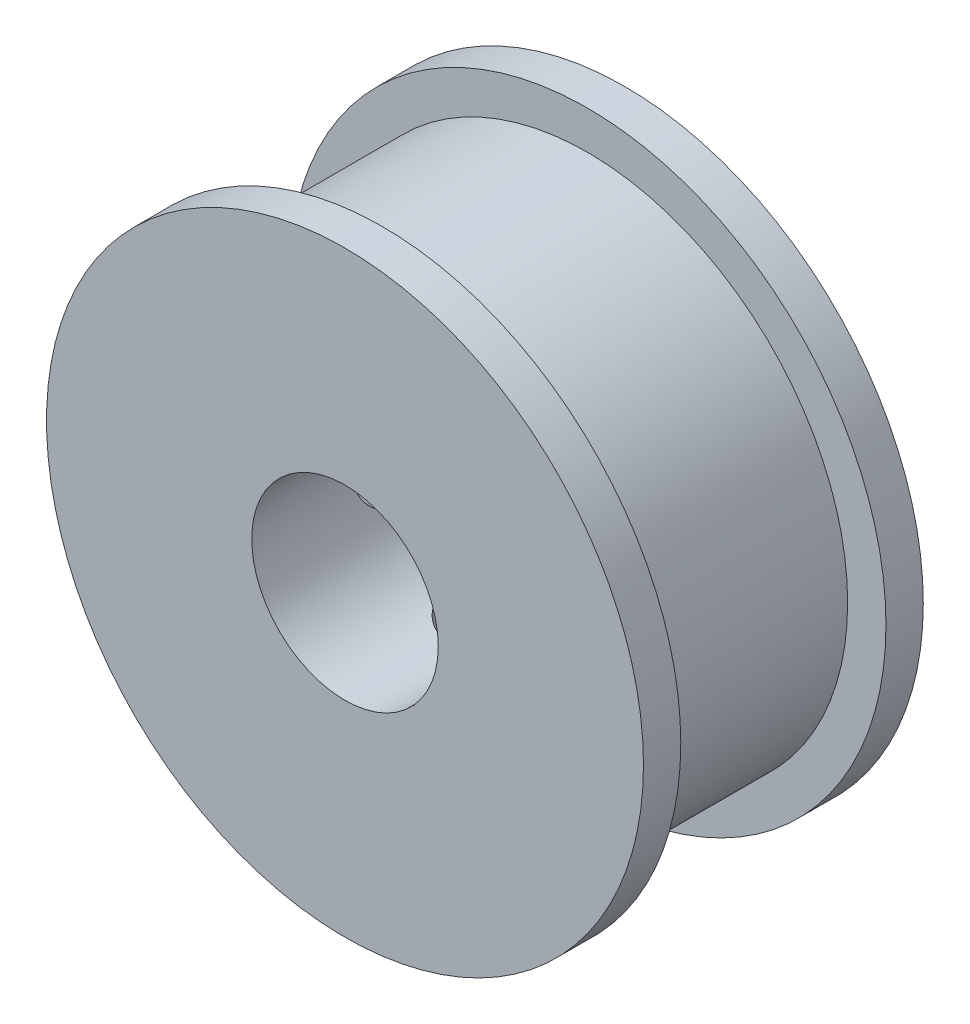
ISO-10303-21;
HEADER;
FILE_DESCRIPTION(('STEP AP214'),'2;1');
FILE_NAME('part.step','',(''),(''),'','','');
FILE_SCHEMA(('AUTOMOTIVE_DESIGN { 1 0 10303 214 1 1 1 1 }'));
ENDSEC;
DATA;
#1=APPLICATION_CONTEXT('core data for automotive mechanical design processes');
#2=APPLICATION_PROTOCOL_DEFINITION('international standard','automotive_design',2000,#1);
#3=PRODUCT_CONTEXT('',#1,'mechanical');
#4=PRODUCT('Part','Part','',(#3));
#5=PRODUCT_RELATED_PRODUCT_CATEGORY('part','',(#4));
#6=PRODUCT_DEFINITION_FORMATION('','',#4);
#7=PRODUCT_DEFINITION_CONTEXT('part definition',#1,'design');
#8=PRODUCT_DEFINITION('design','',#6,#7);
#9=PRODUCT_DEFINITION_SHAPE('','',#8);
#10=(LENGTH_UNIT() NAMED_UNIT(*) SI_UNIT(.MILLI.,.METRE.));
#11=(NAMED_UNIT(*) PLANE_ANGLE_UNIT() SI_UNIT($,.RADIAN.));
#12=(NAMED_UNIT(*) SI_UNIT($,.STERADIAN.) SOLID_ANGLE_UNIT());
#13=UNCERTAINTY_MEASURE_WITH_UNIT(LENGTH_MEASURE(1.E-05),#10,'distance_accuracy_value','');
#14=(GEOMETRIC_REPRESENTATION_CONTEXT(3) GLOBAL_UNCERTAINTY_ASSIGNED_CONTEXT((#13)) GLOBAL_UNIT_ASSIGNED_CONTEXT((#10,
#11,#12)) REPRESENTATION_CONTEXT('',''));
#15=CARTESIAN_POINT('',(0.,0.,0.));
#16=DIRECTION('',(0.,0.,1.));
#17=DIRECTION('',(1.,0.,0.));
#18=AXIS2_PLACEMENT_3D('',#15,#16,#17);
#19=CARTESIAN_POINT('',(0.,0.,2.));
#20=DIRECTION('',(0.,0.,-1.));
#21=DIRECTION('',(-1.,0.,0.));
#22=AXIS2_PLACEMENT_3D('',#19,#20,#21);
#23=CYLINDRICAL_SURFACE('',#22,16.);
#24=CARTESIAN_POINT('',(0.,0.,2.));
#25=DIRECTION('',(0.,0.,1.));
#26=DIRECTION('',(1.,0.,0.));
#27=AXIS2_PLACEMENT_3D('',#24,#25,#26);
#28=CIRCLE('',#27,16.);
#29=CARTESIAN_POINT('',(16.,0.,2.));
#30=VERTEX_POINT('',#29);
#31=EDGE_CURVE('E50',#30,#30,#28,.T.);
#32=ORIENTED_EDGE('',*,*,#31,.F.);
#33=EDGE_LOOP('',(#32));
#34=FACE_BOUND('',#33,.T.);
#35=CARTESIAN_POINT('',(0.,0.,0.));
#36=DIRECTION('',(0.,0.,1.));
#37=DIRECTION('',(1.,0.,0.));
#38=AXIS2_PLACEMENT_3D('',#35,#36,#37);
#39=CIRCLE('',#38,16.);
#40=CARTESIAN_POINT('',(16.,0.,0.));
#41=VERTEX_POINT('',#40);
#42=EDGE_CURVE('E56',#41,#41,#39,.T.);
#43=ORIENTED_EDGE('',*,*,#42,.T.);
#44=EDGE_LOOP('',(#43));
#45=FACE_BOUND('',#44,.T.);
#46=ADVANCED_FACE('F37',(#34,#45),#23,.T.);
#47=CARTESIAN_POINT('',(0.,0.,2.));
#48=DIRECTION('',(0.,0.,1.));
#49=DIRECTION('',(1.,0.,0.));
#50=AXIS2_PLACEMENT_3D('',#47,#48,#49);
#51=PLANE('',#50);
#52=CARTESIAN_POINT('',(0.,0.,2.));
#53=DIRECTION('',(0.,0.,1.));
#54=DIRECTION('',(1.,0.,0.));
#55=AXIS2_PLACEMENT_3D('',#52,#53,#54);
#56=CIRCLE('',#55,13.945);
#57=CARTESIAN_POINT('',(13.945,0.,2.));
#58=VERTEX_POINT('',#57);
#59=EDGE_CURVE('E10',#58,#58,#56,.T.);
#60=ORIENTED_EDGE('',*,*,#59,.F.);
#61=EDGE_LOOP('',(#60));
#62=FACE_BOUND('',#61,.T.);
#63=ORIENTED_EDGE('',*,*,#31,.T.);
#64=EDGE_LOOP('',(#63));
#65=FACE_BOUND('',#64,.T.);
#66=ADVANCED_FACE('F107',(#62,#65),#51,.T.);
#67=CARTESIAN_POINT('',(0.,0.,0.));
#68=DIRECTION('',(0.,0.,1.));
#69=DIRECTION('',(1.,0.,0.));
#70=AXIS2_PLACEMENT_3D('',#67,#68,#69);
#71=PLANE('',#70);
#72=CARTESIAN_POINT('',(0.,0.,0.));
#73=DIRECTION('',(0.,0.,1.));
#74=DIRECTION('',(1.,0.,0.));
#75=AXIS2_PLACEMENT_3D('',#72,#73,#74);
#76=CIRCLE('',#75,5.);
#77=CARTESIAN_POINT('',(5.,0.,0.));
#78=VERTEX_POINT('',#77);
#79=EDGE_CURVE('E96',#78,#78,#76,.T.);
#80=ORIENTED_EDGE('',*,*,#79,.T.);
#81=EDGE_LOOP('',(#80));
#82=FACE_BOUND('',#81,.T.);
#83=ORIENTED_EDGE('',*,*,#42,.F.);
#84=EDGE_LOOP('',(#83));
#85=FACE_BOUND('',#84,.T.);
#86=ADVANCED_FACE('F104',(#82,#85),#71,.F.);
#87=CARTESIAN_POINT('',(0.,0.,13.));
#88=DIRECTION('',(0.,0.,-1.));
#89=DIRECTION('',(-1.,0.,0.));
#90=AXIS2_PLACEMENT_3D('',#87,#88,#89);
#91=CYLINDRICAL_SURFACE('',#90,13.945);
#92=CARTESIAN_POINT('',(-13.945,0.,9.5));
#93=CARTESIAN_POINT('',(-13.9449982655467,-0.111725944881087,9.49999535043122));
#94=CARTESIAN_POINT('',(-13.9436431920022,-0.223518121905761,9.49060638937284));
#95=CARTESIAN_POINT('',(-13.9383679288523,-0.443981632184145,9.45330589604952));
#96=CARTESIAN_POINT('',(-13.9344451909274,-0.552649752951827,9.42537596210905));
#97=CARTESIAN_POINT('',(-13.9244757326362,-0.76364237886481,9.35184193419321));
#98=CARTESIAN_POINT('',(-13.9184305689848,-0.865971468897057,9.30625079148636));
#99=CARTESIAN_POINT('',(-13.9048854651112,-1.06151001299836,9.19871927063412));
#100=CARTESIAN_POINT('',(-13.897385740202,-1.15472081374425,9.13678131175586));
#101=CARTESIAN_POINT('',(-13.8817063382048,-1.3300616267768,8.99784094992483));
#102=CARTESIAN_POINT('',(-13.8735226128042,-1.41211682406785,8.92074457845407));
#103=CARTESIAN_POINT('',(-13.8574295164984,-1.5621720009626,8.75387800901321));
#104=CARTESIAN_POINT('',(-13.8495201608663,-1.63017119916254,8.66410710690485));
#105=CARTESIAN_POINT('',(-13.834831945192,-1.75047203324694,8.4739414372933));
#106=CARTESIAN_POINT('',(-13.8280583146169,-1.802701896444,8.37350082673225));
#107=CARTESIAN_POINT('',(-13.8164633174062,-1.88952287360959,8.16515971008703));
#108=CARTESIAN_POINT('',(-13.8116418535523,-1.9241148659692,8.05725957580174));
#109=CARTESIAN_POINT('',(-13.8045366341998,-1.97444713447729,7.83784652377838));
#110=CARTESIAN_POINT('',(-13.8022357044637,-1.99031504940842,7.72636345192361));
#111=CARTESIAN_POINT('',(-13.8003798364863,-2.00314401871672,7.50229496437047));
#112=CARTESIAN_POINT('',(-13.8008247539011,-2.00010606693928,7.38970960692779));
#113=CARTESIAN_POINT('',(-13.8043945997532,-1.97531397667889,7.167530664799));
#114=CARTESIAN_POINT('',(-13.8074992348458,-1.95370155530977,7.0579208935947));
#115=CARTESIAN_POINT('',(-13.8160070185916,-1.89259566227822,6.8438998341425));
#116=CARTESIAN_POINT('',(-13.8214102271404,-1.85310172466259,6.73948868143792));
#117=CARTESIAN_POINT('',(-13.8339289400293,-1.75720511736295,6.53839498345596));
#118=CARTESIAN_POINT('',(-13.8410505489524,-1.70074198532541,6.44174166675793));
#119=CARTESIAN_POINT('',(-13.8561991469752,-1.57255288207828,6.259227948228));
#120=CARTESIAN_POINT('',(-13.8642261904513,-1.50082599396734,6.17336819526388));
#121=CARTESIAN_POINT('',(-13.8803710383376,-1.34336543087744,6.01405715530256));
#122=CARTESIAN_POINT('',(-13.8884890021574,-1.2575098237008,5.94072634670625));
#123=CARTESIAN_POINT('',(-13.903832789545,-1.07464570955332,5.80949665037276));
#124=CARTESIAN_POINT('',(-13.9110586097879,-0.977637161018896,5.75159782014847));
#125=CARTESIAN_POINT('',(-13.9238105911513,-0.775119683667868,5.65287114178863));
#126=CARTESIAN_POINT('',(-13.9293358753501,-0.669606404455077,5.6120520973623));
#127=CARTESIAN_POINT('',(-13.9380567590545,-0.453125871305182,5.54874587133081));
#128=CARTESIAN_POINT('',(-13.9412525024255,-0.342158954619727,5.52625755766625));
#129=CARTESIAN_POINT('',(-13.9449352790098,-0.118961431261062,5.50041021912956));
#130=CARTESIAN_POINT('',(-13.9454457780248,-0.00675038897306506,5.49688546932927));
#131=CARTESIAN_POINT('',(-13.9437642773937,0.2166610480285,5.50862613849228));
#132=CARTESIAN_POINT('',(-13.9415723540364,0.32786147118233,5.52389102702867));
#133=CARTESIAN_POINT('',(-13.9347468235621,0.545596751155939,5.57263987951943));
#134=CARTESIAN_POINT('',(-13.9301239754049,0.65214994333569,5.60604358451257));
#135=CARTESIAN_POINT('',(-13.9189534759039,0.858143112440643,5.69003756030219));
#136=CARTESIAN_POINT('',(-13.9124057409701,0.957582780220601,5.74062857749002));
#137=CARTESIAN_POINT('',(-13.8980553366504,1.1472581199749,5.85795328605779));
#138=CARTESIAN_POINT('',(-13.8902445663647,1.23742778076889,5.92479268699532));
#139=CARTESIAN_POINT('',(-13.874264016036,1.4053289588581,6.0725690039025));
#140=CARTESIAN_POINT('',(-13.8660942170238,1.48305981794751,6.15350666541614));
#141=CARTESIAN_POINT('',(-13.8502425418994,1.6244757275981,6.32791763946523));
#142=CARTESIAN_POINT('',(-13.8425648264667,1.68805002357053,6.4214811890343));
#143=CARTESIAN_POINT('',(-13.8286388613517,1.79857964993521,6.61805623292917));
#144=CARTESIAN_POINT('',(-13.82239057571,1.84553539840802,6.72106748949248));
#145=CARTESIAN_POINT('',(-13.8120605902263,1.92132120964418,6.93327600223782));
#146=CARTESIAN_POINT('',(-13.8079717917124,1.95021071817875,7.04245166795921));
#147=CARTESIAN_POINT('',(-13.8024044544715,1.98923385843402,7.26416789677154));
#148=CARTESIAN_POINT('',(-13.8009257522239,1.99936866512387,7.37670824861832));
#149=CARTESIAN_POINT('',(-13.800751775432,2.00056854479561,7.60085595836024));
#150=CARTESIAN_POINT('',(-13.8020310901411,1.9918077107637,7.71246240387671));
#151=CARTESIAN_POINT('',(-13.8071739433262,1.95583683286525,7.93259771515098));
#152=CARTESIAN_POINT('',(-13.8110374790295,1.92862680879322,8.04112658421065));
#153=CARTESIAN_POINT('',(-13.8209048536763,1.85658955692229,8.25198480629022));
#154=CARTESIAN_POINT('',(-13.8269073413472,1.81177344985481,8.35431802574034));
#155=CARTESIAN_POINT('',(-13.8403780835011,1.70581339864733,8.55004085937553));
#156=CARTESIAN_POINT('',(-13.8478463789721,1.64466899790683,8.64343022335753));
#157=CARTESIAN_POINT('',(-13.8634893350983,1.50715159888151,8.81950052775766));
#158=CARTESIAN_POINT('',(-13.8716696306741,1.43064939160746,8.90208006101393));
#159=CARTESIAN_POINT('',(-13.8877670585951,1.26486070627031,9.05329221879918));
#160=CARTESIAN_POINT('',(-13.8956841291144,1.17557125053641,9.12192158582665));
#161=CARTESIAN_POINT('',(-13.9104080620764,0.986219027398785,9.24358924430717));
#162=CARTESIAN_POINT('',(-13.9172091614366,0.886104508435573,9.29654767147628));
#163=CARTESIAN_POINT('',(-13.9288779866587,0.678354067742358,9.38482020004785));
#164=CARTESIAN_POINT('',(-13.9337477415888,0.570726180147766,9.420152829212));
#165=CARTESIAN_POINT('',(-13.9398759727421,0.385494842989387,9.46403022878396));
#166=CARTESIAN_POINT('',(-13.9417877583291,0.309042203670669,9.47749862894637));
#167=CARTESIAN_POINT('',(-13.9443503670583,0.155070338741732,9.49548507955022));
#168=CARTESIAN_POINT('',(-13.9450012039173,0.0775511247432515,9.50000322735501));
#169=CARTESIAN_POINT('',(-13.945,0.,9.5));
#170=B_SPLINE_CURVE_WITH_KNOTS('',3,(#92,#93,#94,#95,#96,#97,#98,#99,#100,#101,#102,#103,#104,
#105,#106,#107,#108,#109,#110,#111,#112,#113,#114,#115,#116,#117,#118,#119,#120,#121,#122,#123,
#124,#125,#126,#127,#128,#129,#130,#131,#132,#133,#134,#135,#136,#137,#138,#139,#140,#141,#142,
#143,#144,#145,#146,#147,#148,#149,#150,#151,#152,#153,#154,#155,#156,#157,#158,#159,#160,#161,
#162,#163,#164,#165,#166,#167,#168,#169),.UNSPECIFIED.,.T.,.F.,(4,2,2,2,2,2,2,2,2,2,2,2,2,2,2,2,
2,2,2,2,2,2,2,2,2,2,2,2,2,2,2,2,2,2,2,2,2,2,4),(0.,0.334894486280671,0.670121848927922,
1.00510384751603,1.34003629780493,1.6771144996819,2.01421143543773,2.35282027784864,
2.69141225540951,3.02768252571801,3.36393511908837,3.69764476266522,4.03136310248575,
4.36628489115792,4.70122680442871,5.03922750672538,5.37722946868748,5.71540543846661,
6.05356052177335,6.38875556748366,6.72394115093624,7.05765557953602,7.39138450216532,
7.72734562512789,8.06332451977787,8.40184618887145,8.74035934101194,9.07775269481334,
9.41512491043806,9.74940206946978,10.0836788698493,10.4177448657622,10.7518202043955,
11.0888338092082,11.425926019848,11.764707691787,12.1031324912221,12.335591716681,
12.5680484133688),.UNSPECIFIED.);
#171=CARTESIAN_POINT('',(-13.945,0.,9.5));
#172=VERTEX_POINT('',#171);
#173=EDGE_CURVE('E72',#172,#172,#170,.T.);
#174=ORIENTED_EDGE('',*,*,#173,.T.);
#175=EDGE_LOOP('',(#174));
#176=FACE_BOUND('',#175,.T.);
#177=CARTESIAN_POINT('',(0.,-13.945,9.5));
#178=CARTESIAN_POINT('',(0.111725944881087,-13.9449982655467,9.49999535043122));
#179=CARTESIAN_POINT('',(0.223518121905761,-13.9436431920022,9.49060638937284));
#180=CARTESIAN_POINT('',(0.443981632184145,-13.9383679288523,9.45330589604952));
#181=CARTESIAN_POINT('',(0.552649752951827,-13.9344451909274,9.42537596210905));
#182=CARTESIAN_POINT('',(0.763642378864811,-13.9244757326362,9.35184193419321));
#183=CARTESIAN_POINT('',(0.865971468897056,-13.9184305689848,9.30625079148636));
#184=CARTESIAN_POINT('',(1.06151001299836,-13.9048854651112,9.19871927063412));
#185=CARTESIAN_POINT('',(1.15472081374425,-13.897385740202,9.13678131175586));
#186=CARTESIAN_POINT('',(1.3300616267768,-13.8817063382048,8.99784094992483));
#187=CARTESIAN_POINT('',(1.41211682406784,-13.8735226128042,8.92074457845407));
#188=CARTESIAN_POINT('',(1.5621720009626,-13.8574295164984,8.75387800901321));
#189=CARTESIAN_POINT('',(1.63017119916254,-13.8495201608663,8.66410710690485));
#190=CARTESIAN_POINT('',(1.75047203324694,-13.834831945192,8.4739414372933));
#191=CARTESIAN_POINT('',(1.802701896444,-13.8280583146169,8.37350082673225));
#192=CARTESIAN_POINT('',(1.88952287360959,-13.8164633174062,8.16515971008703));
#193=CARTESIAN_POINT('',(1.9241148659692,-13.8116418535523,8.05725957580175));
#194=CARTESIAN_POINT('',(1.97444713447729,-13.8045366341998,7.83784652377838));
#195=CARTESIAN_POINT('',(1.99031504940842,-13.8022357044637,7.72636345192361));
#196=CARTESIAN_POINT('',(2.00314401871672,-13.8003798364863,7.50229496437047));
#197=CARTESIAN_POINT('',(2.00010606693928,-13.8008247539011,7.38970960692779));
#198=CARTESIAN_POINT('',(1.97531397667889,-13.8043945997532,7.167530664799));
#199=CARTESIAN_POINT('',(1.95370155530977,-13.8074992348458,7.0579208935947));
#200=CARTESIAN_POINT('',(1.89259566227822,-13.8160070185916,6.8438998341425));
#201=CARTESIAN_POINT('',(1.85310172466259,-13.8214102271404,6.73948868143792));
#202=CARTESIAN_POINT('',(1.75720511736295,-13.8339289400293,6.53839498345596));
#203=CARTESIAN_POINT('',(1.70074198532541,-13.8410505489524,6.44174166675793));
#204=CARTESIAN_POINT('',(1.57255288207828,-13.8561991469752,6.259227948228));
#205=CARTESIAN_POINT('',(1.50082599396734,-13.8642261904513,6.17336819526388));
#206=CARTESIAN_POINT('',(1.34336543087744,-13.8803710383376,6.01405715530256));
#207=CARTESIAN_POINT('',(1.2575098237008,-13.8884890021574,5.94072634670625));
#208=CARTESIAN_POINT('',(1.07464570955332,-13.903832789545,5.80949665037276));
#209=CARTESIAN_POINT('',(0.977637161018895,-13.9110586097879,5.75159782014847));
#210=CARTESIAN_POINT('',(0.775119683667867,-13.9238105911513,5.65287114178863));
#211=CARTESIAN_POINT('',(0.669606404455077,-13.9293358753501,5.6120520973623));
#212=CARTESIAN_POINT('',(0.453125871305181,-13.9380567590545,5.54874587133081));
#213=CARTESIAN_POINT('',(0.342158954619726,-13.9412525024255,5.52625755766625));
#214=CARTESIAN_POINT('',(0.118961431261061,-13.9449352790098,5.50041021912956));
#215=CARTESIAN_POINT('',(0.00675038897306411,-13.9454457780248,5.49688546932927));
#216=CARTESIAN_POINT('',(-0.216661048028501,-13.9437642773937,5.50862613849228));
#217=CARTESIAN_POINT('',(-0.32786147118233,-13.9415723540364,5.52389102702867));
#218=CARTESIAN_POINT('',(-0.545596751155938,-13.9347468235621,5.57263987951943));
#219=CARTESIAN_POINT('',(-0.652149943335689,-13.9301239754049,5.60604358451257));
#220=CARTESIAN_POINT('',(-0.858143112440642,-13.9189534759039,5.69003756030219));
#221=CARTESIAN_POINT('',(-0.9575827802206,-13.9124057409701,5.74062857749002));
#222=CARTESIAN_POINT('',(-1.1472581199749,-13.8980553366504,5.85795328605779));
#223=CARTESIAN_POINT('',(-1.23742778076889,-13.8902445663647,5.92479268699532));
#224=CARTESIAN_POINT('',(-1.4053289588581,-13.874264016036,6.0725690039025));
#225=CARTESIAN_POINT('',(-1.48305981794751,-13.8660942170238,6.15350666541614));
#226=CARTESIAN_POINT('',(-1.6244757275981,-13.8502425418994,6.32791763946523));
#227=CARTESIAN_POINT('',(-1.68805002357053,-13.8425648264667,6.4214811890343));
#228=CARTESIAN_POINT('',(-1.79857964993521,-13.8286388613517,6.61805623292917));
#229=CARTESIAN_POINT('',(-1.84553539840802,-13.82239057571,6.72106748949248));
#230=CARTESIAN_POINT('',(-1.92132120964418,-13.8120605902263,6.93327600223782));
#231=CARTESIAN_POINT('',(-1.95021071817875,-13.8079717917124,7.04245166795921));
#232=CARTESIAN_POINT('',(-1.98923385843402,-13.8024044544715,7.26416789677155));
#233=CARTESIAN_POINT('',(-1.99936866512387,-13.8009257522239,7.37670824861832));
#234=CARTESIAN_POINT('',(-2.00056854479561,-13.800751775432,7.60085595836024));
#235=CARTESIAN_POINT('',(-1.9918077107637,-13.8020310901411,7.71246240387671));
#236=CARTESIAN_POINT('',(-1.95583683286525,-13.8071739433262,7.93259771515098));
#237=CARTESIAN_POINT('',(-1.92862680879322,-13.8110374790295,8.04112658421065));
#238=CARTESIAN_POINT('',(-1.85658955692229,-13.8209048536763,8.25198480629022));
#239=CARTESIAN_POINT('',(-1.81177344985481,-13.8269073413472,8.35431802574033));
#240=CARTESIAN_POINT('',(-1.70581339864734,-13.8403780835011,8.55004085937553));
#241=CARTESIAN_POINT('',(-1.64466899790683,-13.8478463789721,8.64343022335753));
#242=CARTESIAN_POINT('',(-1.50715159888151,-13.8634893350983,8.81950052775766));
#243=CARTESIAN_POINT('',(-1.43064939160746,-13.8716696306741,8.90208006101393));
#244=CARTESIAN_POINT('',(-1.26486070627031,-13.8877670585951,9.05329221879918));
#245=CARTESIAN_POINT('',(-1.17557125053641,-13.8956841291144,9.12192158582665));
#246=CARTESIAN_POINT('',(-0.986219027398784,-13.9104080620764,9.24358924430717));
#247=CARTESIAN_POINT('',(-0.886104508435573,-13.9172091614366,9.29654767147628));
#248=CARTESIAN_POINT('',(-0.678354067742358,-13.9288779866587,9.38482020004785));
#249=CARTESIAN_POINT('',(-0.570726180147766,-13.9337477415888,9.420152829212));
#250=CARTESIAN_POINT('',(-0.385494842989387,-13.9398759727421,9.46403022878395));
#251=CARTESIAN_POINT('',(-0.309042203670669,-13.9417877583291,9.47749862894637));
#252=CARTESIAN_POINT('',(-0.155070338741732,-13.9443503670583,9.49548507955022));
#253=CARTESIAN_POINT('',(-0.0775511247432517,-13.9450012039173,9.50000322735501));
#254=CARTESIAN_POINT('',(0.,-13.945,9.5));
#255=B_SPLINE_CURVE_WITH_KNOTS('',3,(#177,#178,#179,#180,#181,#182,#183,#184,#185,#186,#187,
#188,#189,#190,#191,#192,#193,#194,#195,#196,#197,#198,#199,#200,#201,#202,#203,#204,#205,#206,
#207,#208,#209,#210,#211,#212,#213,#214,#215,#216,#217,#218,#219,#220,#221,#222,#223,#224,#225,
#226,#227,#228,#229,#230,#231,#232,#233,#234,#235,#236,#237,#238,#239,#240,#241,#242,#243,#244,
#245,#246,#247,#248,#249,#250,#251,#252,#253,#254),.UNSPECIFIED.,.T.,.F.,(4,2,2,2,2,2,2,2,2,2,2,
2,2,2,2,2,2,2,2,2,2,2,2,2,2,2,2,2,2,2,2,2,2,2,2,2,2,2,4),(0.,0.334894486280671,
0.670121848927922,1.00510384751603,1.34003629780493,1.6771144996819,2.01421143543773,
2.35282027784864,2.69141225540951,3.02768252571801,3.36393511908837,3.69764476266522,
4.03136310248575,4.36628489115792,4.70122680442871,5.03922750672538,5.37722946868748,
5.71540543846661,6.05356052177335,6.38875556748366,6.72394115093624,7.05765557953602,
7.39138450216532,7.72734562512789,8.06332451977787,8.40184618887145,8.74035934101194,
9.07775269481334,9.41512491043806,9.74940206946978,10.0836788698493,10.4177448657622,
10.7518202043955,11.0888338092082,11.425926019848,11.764707691787,12.1031324912221,
12.335591716681,12.5680484133688),.UNSPECIFIED.);
#256=CARTESIAN_POINT('',(0.,-13.945,9.5));
#257=VERTEX_POINT('',#256);
#258=EDGE_CURVE('E71',#257,#257,#255,.T.);
#259=ORIENTED_EDGE('',*,*,#258,.T.);
#260=EDGE_LOOP('',(#259));
#261=FACE_BOUND('',#260,.T.);
#262=CARTESIAN_POINT('',(0.,0.,13.));
#263=DIRECTION('',(0.,0.,1.));
#264=DIRECTION('',(1.,0.,0.));
#265=AXIS2_PLACEMENT_3D('',#262,#263,#264);
#266=CIRCLE('',#265,13.945);
#267=CARTESIAN_POINT('',(13.945,0.,13.));
#268=VERTEX_POINT('',#267);
#269=EDGE_CURVE('E59',#268,#268,#266,.T.);
#270=ORIENTED_EDGE('',*,*,#269,.F.);
#271=EDGE_LOOP('',(#270));
#272=FACE_BOUND('',#271,.T.);
#273=ORIENTED_EDGE('',*,*,#59,.T.);
#274=EDGE_LOOP('',(#273));
#275=FACE_BOUND('',#274,.T.);
#276=ADVANCED_FACE('F98',(#176,#261,#272,#275),#91,.T.);
#277=CARTESIAN_POINT('',(0.,0.,15.));
#278=DIRECTION('',(0.,0.,-1.));
#279=DIRECTION('',(-1.,0.,0.));
#280=AXIS2_PLACEMENT_3D('',#277,#278,#279);
#281=CYLINDRICAL_SURFACE('',#280,16.);
#282=CARTESIAN_POINT('',(0.,0.,15.));
#283=DIRECTION('',(0.,0.,1.));
#284=DIRECTION('',(1.,0.,0.));
#285=AXIS2_PLACEMENT_3D('',#282,#283,#284);
#286=CIRCLE('',#285,16.);
#287=CARTESIAN_POINT('',(16.,0.,15.));
#288=VERTEX_POINT('',#287);
#289=EDGE_CURVE('E209',#288,#288,#286,.T.);
#290=ORIENTED_EDGE('',*,*,#289,.F.);
#291=EDGE_LOOP('',(#290));
#292=FACE_BOUND('',#291,.T.);
#293=CARTESIAN_POINT('',(0.,0.,13.));
#294=DIRECTION('',(0.,0.,1.));
#295=DIRECTION('',(1.,0.,0.));
#296=AXIS2_PLACEMENT_3D('',#293,#294,#295);
#297=CIRCLE('',#296,16.);
#298=CARTESIAN_POINT('',(16.,0.,13.));
#299=VERTEX_POINT('',#298);
#300=EDGE_CURVE('E207',#299,#299,#297,.T.);
#301=ORIENTED_EDGE('',*,*,#300,.T.);
#302=EDGE_LOOP('',(#301));
#303=FACE_BOUND('',#302,.T.);
#304=ADVANCED_FACE('F103',(#292,#303),#281,.T.);
#305=CARTESIAN_POINT('',(0.,0.,15.));
#306=DIRECTION('',(0.,0.,1.));
#307=DIRECTION('',(1.,0.,0.));
#308=AXIS2_PLACEMENT_3D('',#305,#306,#307);
#309=PLANE('',#308);
#310=CARTESIAN_POINT('',(0.,0.,15.));
#311=DIRECTION('',(0.,0.,1.));
#312=DIRECTION('',(1.,0.,0.));
#313=AXIS2_PLACEMENT_3D('',#310,#311,#312);
#314=CIRCLE('',#313,5.);
#315=CARTESIAN_POINT('',(5.,0.,15.));
#316=VERTEX_POINT('',#315);
#317=EDGE_CURVE('E92',#316,#316,#314,.T.);
#318=ORIENTED_EDGE('',*,*,#317,.F.);
#319=EDGE_LOOP('',(#318));
#320=FACE_BOUND('',#319,.T.);
#321=ORIENTED_EDGE('',*,*,#289,.T.);
#322=EDGE_LOOP('',(#321));
#323=FACE_BOUND('',#322,.T.);
#324=ADVANCED_FACE('F139',(#320,#323),#309,.T.);
#325=CARTESIAN_POINT('',(0.,0.,13.));
#326=DIRECTION('',(0.,0.,1.));
#327=DIRECTION('',(1.,0.,0.));
#328=AXIS2_PLACEMENT_3D('',#325,#326,#327);
#329=PLANE('',#328);
#330=ORIENTED_EDGE('',*,*,#269,.T.);
#331=EDGE_LOOP('',(#330));
#332=FACE_BOUND('',#331,.T.);
#333=ORIENTED_EDGE('',*,*,#300,.F.);
#334=EDGE_LOOP('',(#333));
#335=FACE_BOUND('',#334,.T.);
#336=ADVANCED_FACE('F147',(#332,#335),#329,.F.);
#337=CARTESIAN_POINT('',(0.,0.,0.));
#338=DIRECTION('',(0.,0.,1.));
#339=DIRECTION('',(1.,0.,0.));
#340=AXIS2_PLACEMENT_3D('',#337,#338,#339);
#341=CYLINDRICAL_SURFACE('',#340,5.);
#342=CARTESIAN_POINT('',(-5.,0.,5.5));
#343=CARTESIAN_POINT('',(-4.99999271227085,-0.107493005442891,5.50000985182373));
#344=CARTESIAN_POINT('',(-4.99649294306932,-0.215172564090673,5.50871775208838));
#345=CARTESIAN_POINT('',(-4.98283453100641,-0.427496480417896,5.54324770352124));
#346=CARTESIAN_POINT('',(-4.97265778698877,-0.532131777561248,5.56911627908613));
#347=CARTESIAN_POINT('',(-4.94674209213118,-0.734953922727403,5.63687607805883));
#348=CARTESIAN_POINT('',(-4.93102136364072,-0.833160661616959,5.67871484621673));
#349=CARTESIAN_POINT('',(-4.89556610796078,-1.02107197032837,5.77701917332655));
#350=CARTESIAN_POINT('',(-4.87583297458057,-1.11077947675099,5.83347965491893));
#351=CARTESIAN_POINT('',(-4.83330886170419,-1.28350100757039,5.96223549856094));
#352=CARTESIAN_POINT('',(-4.8104229692919,-1.36606227255021,6.03510665624026));
#353=CARTESIAN_POINT('',(-4.76460576906194,-1.51817500478472,6.19340000347678));
#354=CARTESIAN_POINT('',(-4.74167444453792,-1.58772010713353,6.27882829721174));
#355=CARTESIAN_POINT('',(-4.69722791797136,-1.71487456729288,6.46442807024227));
#356=CARTESIAN_POINT('',(-4.67582115964951,-1.77181498119547,6.5650864860232));
#357=CARTESIAN_POINT('',(-4.63833647186792,-1.86775471903715,6.77553639842004));
#358=CARTESIAN_POINT('',(-4.62225601244176,-1.90676256428583,6.88532352784836));
#359=CARTESIAN_POINT('',(-4.59826357660818,-1.96389882339587,7.1057123335921));
#360=CARTESIAN_POINT('',(-4.59001420355605,-1.98289396580565,7.21605123557621));
#361=CARTESIAN_POINT('',(-4.58164004049144,-2.00217296164003,7.43863499830727));
#362=CARTESIAN_POINT('',(-4.58151125522768,-2.00246601631322,7.55087889462501));
#363=CARTESIAN_POINT('',(-4.58910500279994,-1.98498936750454,7.76575667145804));
#364=CARTESIAN_POINT('',(-4.5962817503845,-1.96847531430514,7.86851571440903));
#365=CARTESIAN_POINT('',(-4.61676187607836,-1.91994688029782,8.06965955600671));
#366=CARTESIAN_POINT('',(-4.63006632321673,-1.88792979480463,8.16804358811031));
#367=CARTESIAN_POINT('',(-4.6615948508853,-1.80869473255107,8.36001783619604));
#368=CARTESIAN_POINT('',(-4.67991379280788,-1.76117986231532,8.45346923905469));
#369=CARTESIAN_POINT('',(-4.7193811638989,-1.65250646073221,8.63141581636157));
#370=CARTESIAN_POINT('',(-4.74053065456849,-1.59134280510084,8.71590760940281));
#371=CARTESIAN_POINT('',(-4.78526736742271,-1.45155059945443,8.880409728802));
#372=CARTESIAN_POINT('',(-4.80891664976152,-1.37193746297063,8.95956872944602));
#373=CARTESIAN_POINT('',(-4.85459824958282,-1.20031442743019,9.10368447800204));
#374=CARTESIAN_POINT('',(-4.87663024445325,-1.10830206533443,9.16863839741029));
#375=CARTESIAN_POINT('',(-4.91714681264548,-0.912077652605843,9.28361744741583));
#376=CARTESIAN_POINT('',(-4.93555270095415,-0.807660491346477,9.33332228119705));
#377=CARTESIAN_POINT('',(-4.96614828328759,-0.591023765482881,9.41416786107806));
#378=CARTESIAN_POINT('',(-4.97834113462382,-0.478808196849673,9.44531803755741));
#379=CARTESIAN_POINT('',(-4.99456139506911,-0.25689588760782,9.4864482954197));
#380=CARTESIAN_POINT('',(-4.99902945833514,-0.147443293985534,9.49757245425356));
#381=CARTESIAN_POINT('',(-5.00068478510631,0.0718453098078173,9.50171310052861));
#382=CARTESIAN_POINT('',(-4.99787393582291,0.181681213223924,9.49473428154751));
#383=CARTESIAN_POINT('',(-4.98557567063753,0.393432739121987,9.46370824744801));
#384=CARTESIAN_POINT('',(-4.97639391345523,0.495482491775474,9.44044201964903));
#385=CARTESIAN_POINT('',(-4.952594414055,0.69413542806078,9.37856429169019));
#386=CARTESIAN_POINT('',(-4.9379759735653,0.790737910224844,9.33995082033132));
#387=CARTESIAN_POINT('',(-4.90416594770812,0.979078785816702,9.24721506032005));
#388=CARTESIAN_POINT('',(-4.88484815979803,1.07057802275541,9.19265452795685));
#389=CARTESIAN_POINT('',(-4.84373364745525,1.24344359124656,9.07005967609436));
#390=CARTESIAN_POINT('',(-4.8219359311027,1.32480584076113,9.00201995707739));
#391=CARTESIAN_POINT('',(-4.77645117638112,1.48072304302882,8.84912998705037));
#392=CARTESIAN_POINT('',(-4.75273441425052,1.55447393380606,8.76346645849379));
#393=CARTESIAN_POINT('',(-4.70741672917132,1.68675119741371,8.58055991699063));
#394=CARTESIAN_POINT('',(-4.68581615526511,1.74527506133751,8.48331499966005));
#395=CARTESIAN_POINT('',(-4.64714299907709,1.84580750193163,8.27853830540589));
#396=CARTESIAN_POINT('',(-4.63011630884788,1.88765059453445,8.17091600078769));
#397=CARTESIAN_POINT('',(-4.60323673477932,1.9522962197053,7.94926634828484));
#398=CARTESIAN_POINT('',(-4.59337855695998,1.97511280526932,7.83524379418757));
#399=CARTESIAN_POINT('',(-4.58271759299926,1.9997156172784,7.61287209822546));
#400=CARTESIAN_POINT('',(-4.58131421008171,2.00289708230287,7.50470516040665));
#401=CARTESIAN_POINT('',(-4.58614836033098,1.99180315927752,7.28945514228671));
#402=CARTESIAN_POINT('',(-4.59238492324793,1.97752998791378,7.18237192609741));
#403=CARTESIAN_POINT('',(-4.61126649079021,1.93307136615365,6.97666781014496));
#404=CARTESIAN_POINT('',(-4.62364831827449,1.90353749357098,6.877879725567));
#405=CARTESIAN_POINT('',(-4.65324001232696,1.83000544849101,6.68662137038652));
#406=CARTESIAN_POINT('',(-4.67045121206007,1.78600328139381,6.59415285310017));
#407=CARTESIAN_POINT('',(-4.70898609604491,1.68187276275973,6.41239038072922));
#408=CARTESIAN_POINT('',(-4.73048882313242,1.62096533515949,6.32358132986951));
#409=CARTESIAN_POINT('',(-4.77463804372237,1.4858921192715,6.15700668279624));
#410=CARTESIAN_POINT('',(-4.79728488048406,1.41172233481812,6.07924442787168));
#411=CARTESIAN_POINT('',(-4.84293567087394,1.24650550627246,5.93179714673639));
#412=CARTESIAN_POINT('',(-4.86586757962185,1.15467600114614,5.86296269310193));
#413=CARTESIAN_POINT('',(-4.90800406713717,0.95990032028578,5.74166295737836));
#414=CARTESIAN_POINT('',(-4.92720691092906,0.856949004547238,5.68920528784747));
#415=CARTESIAN_POINT('',(-4.95939714815861,0.644738062495203,5.60337778480971));
#416=CARTESIAN_POINT('',(-4.97249363055028,0.535631618219695,5.56967067643966));
#417=CARTESIAN_POINT('',(-4.99144306209366,0.31287654628122,5.52136087904573));
#418=CARTESIAN_POINT('',(-4.99731899495638,0.199243525858912,5.5066975632561));
#419=CARTESIAN_POINT('',(-4.99975899504136,0.0569122978909297,5.50060461902173));
#420=CARTESIAN_POINT('',(-5.00000192969176,0.0284626887407584,5.4999973913708));
#421=CARTESIAN_POINT('',(-5.,0.,5.5));
#422=B_SPLINE_CURVE_WITH_KNOTS('',3,(#342,#343,#344,#345,#346,#347,#348,#349,#350,#351,#352,
#353,#354,#355,#356,#357,#358,#359,#360,#361,#362,#363,#364,#365,#366,#367,#368,#369,#370,#371,
#372,#373,#374,#375,#376,#377,#378,#379,#380,#381,#382,#383,#384,#385,#386,#387,#388,#389,#390,
#391,#392,#393,#394,#395,#396,#397,#398,#399,#400,#401,#402,#403,#404,#405,#406,#407,#408,#409,
#410,#411,#412,#413,#414,#415,#416,#417,#418,#419,#420,#421),.UNSPECIFIED.,.T.,.F.,(4,2,2,2,2,2,
2,2,2,2,2,2,2,2,2,2,2,2,2,2,2,2,2,2,2,2,2,2,2,2,2,2,2,2,2,2,2,2,2,4),(0.,0.322402987893071,
0.645683636007935,0.967911457471581,1.29002753567984,1.62597381700397,1.96208394934411,
2.31315258819217,2.66405423118268,2.99904105308829,3.33386306340488,3.64538328401372,
3.95695787256048,4.27489126298816,4.59294421938183,4.93558349186557,5.27829092839733,
5.62776913162806,5.97706956113791,6.30569184528008,6.63422893570082,6.94800455564366,
7.26182048993797,7.58523513398263,7.90877959498969,8.25368474624414,8.59864669043749,
8.94695045140828,9.29499672645934,9.61799673392749,9.94095572563046,10.2511431854877,
10.5614163580516,10.8894546805669,11.2175920134839,11.5670042353384,11.9165786364053,
12.2596430101332,12.6016125240434,12.686980458968),.UNSPECIFIED.);
#423=CARTESIAN_POINT('',(-5.,0.,5.5));
#424=VERTEX_POINT('',#423);
#425=EDGE_CURVE('E40',#424,#424,#422,.T.);
#426=ORIENTED_EDGE('',*,*,#425,.T.);
#427=EDGE_LOOP('',(#426));
#428=FACE_BOUND('',#427,.T.);
#429=CARTESIAN_POINT('',(0.,-5.,9.5));
#430=CARTESIAN_POINT('',(-0.107493005442891,-4.99999271227085,9.49999014817627));
#431=CARTESIAN_POINT('',(-0.215172564090673,-4.99649294306932,9.49128224791162));
#432=CARTESIAN_POINT('',(-0.427496480417896,-4.98283453100641,9.45675229647876));
#433=CARTESIAN_POINT('',(-0.532131777561248,-4.97265778698877,9.43088372091387));
#434=CARTESIAN_POINT('',(-0.734953922727403,-4.94674209213118,9.36312392194117));
#435=CARTESIAN_POINT('',(-0.833160661616958,-4.93102136364072,9.32128515378327));
#436=CARTESIAN_POINT('',(-1.02107197032837,-4.89556610796078,9.22298082667345));
#437=CARTESIAN_POINT('',(-1.11077947675099,-4.87583297458057,9.16652034508107));
#438=CARTESIAN_POINT('',(-1.28350100757039,-4.83330886170419,9.03776450143906));
#439=CARTESIAN_POINT('',(-1.36606227255021,-4.81042296929191,8.96489334375974));
#440=CARTESIAN_POINT('',(-1.51817500478472,-4.76460576906195,8.80659999652322));
#441=CARTESIAN_POINT('',(-1.58772010713353,-4.74167444453792,8.72117170278826));
#442=CARTESIAN_POINT('',(-1.71487456729288,-4.69722791797136,8.53557192975773));
#443=CARTESIAN_POINT('',(-1.77181498119547,-4.67582115964951,8.4349135139768));
#444=CARTESIAN_POINT('',(-1.86775471903715,-4.63833647186792,8.22446360157996));
#445=CARTESIAN_POINT('',(-1.90676256428583,-4.62225601244176,8.11467647215164));
#446=CARTESIAN_POINT('',(-1.96389882339587,-4.59826357660819,7.8942876664079));
#447=CARTESIAN_POINT('',(-1.98289396580565,-4.59001420355605,7.78394876442379));
#448=CARTESIAN_POINT('',(-2.00217296164003,-4.58164004049144,7.56136500169273));
#449=CARTESIAN_POINT('',(-2.00246601631322,-4.58151125522768,7.44912110537498));
#450=CARTESIAN_POINT('',(-1.98498936750454,-4.58910500279994,7.23424332854196));
#451=CARTESIAN_POINT('',(-1.96847531430514,-4.5962817503845,7.13148428559097));
#452=CARTESIAN_POINT('',(-1.91994688029782,-4.61676187607836,6.93034044399329));
#453=CARTESIAN_POINT('',(-1.88792979480463,-4.63006632321673,6.83195641188969));
#454=CARTESIAN_POINT('',(-1.80869473255107,-4.6615948508853,6.63998216380396));
#455=CARTESIAN_POINT('',(-1.76117986231532,-4.67991379280788,6.54653076094531));
#456=CARTESIAN_POINT('',(-1.65250646073221,-4.7193811638989,6.36858418363844));
#457=CARTESIAN_POINT('',(-1.59134280510084,-4.74053065456848,6.28409239059719));
#458=CARTESIAN_POINT('',(-1.45155059945443,-4.78526736742271,6.119590271198));
#459=CARTESIAN_POINT('',(-1.37193746297063,-4.80891664976152,6.04043127055398));
#460=CARTESIAN_POINT('',(-1.20031442743019,-4.85459824958282,5.89631552199796));
#461=CARTESIAN_POINT('',(-1.10830206533443,-4.87663024445325,5.83136160258971));
#462=CARTESIAN_POINT('',(-0.912077652605843,-4.91714681264548,5.71638255258417));
#463=CARTESIAN_POINT('',(-0.807660491346477,-4.93555270095415,5.66667771880295));
#464=CARTESIAN_POINT('',(-0.591023765482882,-4.96614828328759,5.58583213892194));
#465=CARTESIAN_POINT('',(-0.478808196849674,-4.97834113462382,5.55468196244259));
#466=CARTESIAN_POINT('',(-0.25689588760782,-4.99456139506911,5.5135517045803));
#467=CARTESIAN_POINT('',(-0.147443293985534,-4.99902945833514,5.50242754574644));
#468=CARTESIAN_POINT('',(0.0718453098078172,-5.00068478510631,5.49828689947139));
#469=CARTESIAN_POINT('',(0.181681213223924,-4.99787393582291,5.50526571845249));
#470=CARTESIAN_POINT('',(0.393432739121987,-4.98557567063753,5.53629175255199));
#471=CARTESIAN_POINT('',(0.495482491775474,-4.97639391345523,5.55955798035098));
#472=CARTESIAN_POINT('',(0.69413542806078,-4.952594414055,5.62143570830981));
#473=CARTESIAN_POINT('',(0.790737910224844,-4.9379759735653,5.66004917966868));
#474=CARTESIAN_POINT('',(0.979078785816702,-4.90416594770812,5.75278493967995));
#475=CARTESIAN_POINT('',(1.07057802275541,-4.88484815979804,5.80734547204315));
#476=CARTESIAN_POINT('',(1.24344359124656,-4.84373364745525,5.92994032390564));
#477=CARTESIAN_POINT('',(1.32480584076113,-4.8219359311027,5.99798004292261));
#478=CARTESIAN_POINT('',(1.48072304302882,-4.77645117638112,6.15087001294963));
#479=CARTESIAN_POINT('',(1.55447393380606,-4.75273441425052,6.23653354150621));
#480=CARTESIAN_POINT('',(1.68675119741371,-4.70741672917132,6.41944008300937));
#481=CARTESIAN_POINT('',(1.74527506133751,-4.68581615526511,6.51668500033995));
#482=CARTESIAN_POINT('',(1.84580750193163,-4.64714299907708,6.72146169459411));
#483=CARTESIAN_POINT('',(1.88765059453445,-4.63011630884788,6.82908399921231));
#484=CARTESIAN_POINT('',(1.9522962197053,-4.60323673477931,7.05073365171516));
#485=CARTESIAN_POINT('',(1.97511280526932,-4.59337855695998,7.16475620581243));
#486=CARTESIAN_POINT('',(1.9997156172784,-4.58271759299926,7.38712790177454));
#487=CARTESIAN_POINT('',(2.00289708230287,-4.58131421008171,7.49529483959335));
#488=CARTESIAN_POINT('',(1.99180315927752,-4.58614836033098,7.71054485771329));
#489=CARTESIAN_POINT('',(1.97752998791378,-4.59238492324793,7.81762807390258));
#490=CARTESIAN_POINT('',(1.93307136615365,-4.61126649079021,8.02333218985504));
#491=CARTESIAN_POINT('',(1.90353749357098,-4.62364831827449,8.122120274433));
#492=CARTESIAN_POINT('',(1.83000544849101,-4.65324001232697,8.31337862961348));
#493=CARTESIAN_POINT('',(1.78600328139381,-4.67045121206007,8.40584714689983));
#494=CARTESIAN_POINT('',(1.68187276275973,-4.70898609604491,8.58760961927078));
#495=CARTESIAN_POINT('',(1.62096533515949,-4.73048882313242,8.67641867013048));
#496=CARTESIAN_POINT('',(1.4858921192715,-4.77463804372237,8.84299331720375));
#497=CARTESIAN_POINT('',(1.41172233481812,-4.79728488048406,8.92075557212831));
#498=CARTESIAN_POINT('',(1.24650550627246,-4.84293567087394,9.06820285326362));
#499=CARTESIAN_POINT('',(1.15467600114614,-4.86586757962185,9.13703730689807));
#500=CARTESIAN_POINT('',(0.959900320285779,-4.90800406713717,9.25833704262164));
#501=CARTESIAN_POINT('',(0.856949004547237,-4.92720691092906,9.31079471215253));
#502=CARTESIAN_POINT('',(0.644738062495202,-4.95939714815861,9.39662221519029));
#503=CARTESIAN_POINT('',(0.535631618219695,-4.97249363055028,9.43032932356034));
#504=CARTESIAN_POINT('',(0.312876546281219,-4.99144306209366,9.47863912095427));
#505=CARTESIAN_POINT('',(0.199243525858912,-4.99731899495638,9.4933024367439));
#506=CARTESIAN_POINT('',(0.0569122978909291,-4.99975899504136,9.49939538097827));
#507=CARTESIAN_POINT('',(0.0284626887407581,-5.00000192969176,9.50000260862919));
#508=CARTESIAN_POINT('',(0.,-5.,9.5));
#509=B_SPLINE_CURVE_WITH_KNOTS('',3,(#429,#430,#431,#432,#433,#434,#435,#436,#437,#438,#439,
#440,#441,#442,#443,#444,#445,#446,#447,#448,#449,#450,#451,#452,#453,#454,#455,#456,#457,#458,
#459,#460,#461,#462,#463,#464,#465,#466,#467,#468,#469,#470,#471,#472,#473,#474,#475,#476,#477,
#478,#479,#480,#481,#482,#483,#484,#485,#486,#487,#488,#489,#490,#491,#492,#493,#494,#495,#496,
#497,#498,#499,#500,#501,#502,#503,#504,#505,#506,#507,#508),.UNSPECIFIED.,.T.,.F.,(4,2,2,2,2,2,
2,2,2,2,2,2,2,2,2,2,2,2,2,2,2,2,2,2,2,2,2,2,2,2,2,2,2,2,2,2,2,2,2,4),(0.,0.322402987893071,
0.645683636007934,0.96791145747158,1.29002753567984,1.62597381700397,1.96208394934411,
2.31315258819217,2.66405423118268,2.99904105308829,3.33386306340488,3.64538328401372,
3.95695787256047,4.27489126298816,4.59294421938183,4.93558349186557,5.27829092839733,
5.62776913162806,5.9770695611379,6.30569184528007,6.63422893570082,6.94800455564365,
7.26182048993796,7.58523513398262,7.90877959498969,8.25368474624413,8.59864669043748,
8.94695045140828,9.29499672645934,9.61799673392748,9.94095572563046,10.2511431854877,
10.5614163580516,10.8894546805669,11.2175920134839,11.5670042353384,11.9165786364053,
12.2596430101332,12.6016125240434,12.686980458968),.UNSPECIFIED.);
#510=CARTESIAN_POINT('',(0.,-5.,9.5));
#511=VERTEX_POINT('',#510);
#512=EDGE_CURVE('E64',#511,#511,#509,.T.);
#513=ORIENTED_EDGE('',*,*,#512,.T.);
#514=EDGE_LOOP('',(#513));
#515=FACE_BOUND('',#514,.T.);
#516=ORIENTED_EDGE('',*,*,#79,.F.);
#517=EDGE_LOOP('',(#516));
#518=FACE_BOUND('',#517,.T.);
#519=ORIENTED_EDGE('',*,*,#317,.T.);
#520=EDGE_LOOP('',(#519));
#521=FACE_BOUND('',#520,.T.);
#522=ADVANCED_FACE('F73',(#428,#515,#518,#521),#341,.F.);
#523=CARTESIAN_POINT('',(0.,-20.,7.5));
#524=DIRECTION('',(0.,1.,0.));
#525=DIRECTION('',(0.,0.,1.));
#526=AXIS2_PLACEMENT_3D('',#523,#524,#525);
#527=CYLINDRICAL_SURFACE('',#526,2.);
#528=ORIENTED_EDGE('',*,*,#512,.F.);
#529=EDGE_LOOP('',(#528));
#530=FACE_BOUND('',#529,.T.);
#531=ORIENTED_EDGE('',*,*,#258,.F.);
#532=EDGE_LOOP('',(#531));
#533=FACE_BOUND('',#532,.T.);
#534=ADVANCED_FACE('F76',(#530,#533),#527,.F.);
#535=CARTESIAN_POINT('',(-20.,0.,7.5));
#536=DIRECTION('',(1.,0.,0.));
#537=DIRECTION('',(0.,0.,-1.));
#538=AXIS2_PLACEMENT_3D('',#535,#536,#537);
#539=CYLINDRICAL_SURFACE('',#538,2.);
#540=ORIENTED_EDGE('',*,*,#425,.F.);
#541=EDGE_LOOP('',(#540));
#542=FACE_BOUND('',#541,.T.);
#543=ORIENTED_EDGE('',*,*,#173,.F.);
#544=EDGE_LOOP('',(#543));
#545=FACE_BOUND('',#544,.T.);
#546=ADVANCED_FACE('F79',(#542,#545),#539,.F.);
#547=CLOSED_SHELL('',(#46,#66,#86,#276,#304,#324,#336,#522,#534,#546));
#548=MANIFOLD_SOLID_BREP('B2',#547);
#549=ADVANCED_BREP_SHAPE_REPRESENTATION('',(#18,#548),#14);
#550=SHAPE_DEFINITION_REPRESENTATION(#9,#549);
ENDSEC;
END-ISO-10303-21;
